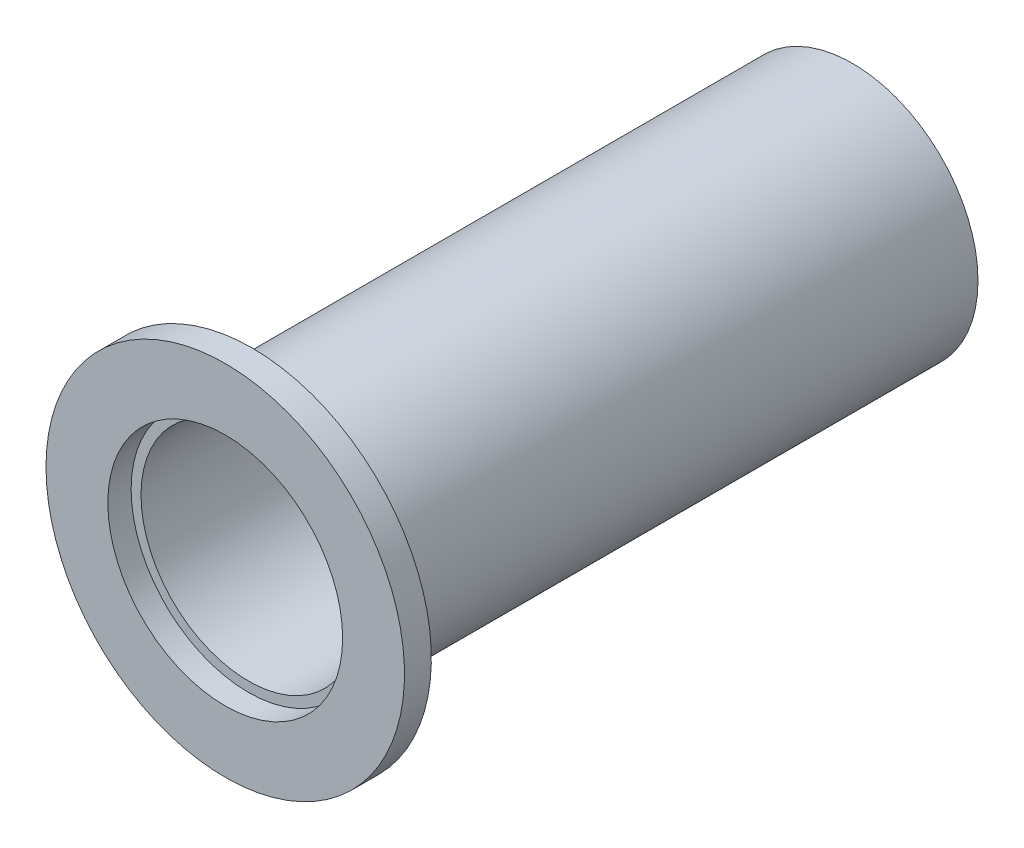
ISO-10303-21;
HEADER;
FILE_DESCRIPTION(('STEP AP214'),'2;1');
FILE_NAME('part.step','',(''),(''),'','','');
FILE_SCHEMA(('AUTOMOTIVE_DESIGN { 1 0 10303 214 1 1 1 1 }'));
ENDSEC;
DATA;
#1=APPLICATION_CONTEXT('core data for automotive mechanical design processes');
#2=APPLICATION_PROTOCOL_DEFINITION('international standard','automotive_design',2000,#1);
#3=PRODUCT_CONTEXT('',#1,'mechanical');
#4=PRODUCT('Part','Part','',(#3));
#5=PRODUCT_RELATED_PRODUCT_CATEGORY('part','',(#4));
#6=PRODUCT_DEFINITION_FORMATION('','',#4);
#7=PRODUCT_DEFINITION_CONTEXT('part definition',#1,'design');
#8=PRODUCT_DEFINITION('design','',#6,#7);
#9=PRODUCT_DEFINITION_SHAPE('','',#8);
#10=(LENGTH_UNIT() NAMED_UNIT(*) SI_UNIT(.MILLI.,.METRE.));
#11=(NAMED_UNIT(*) PLANE_ANGLE_UNIT() SI_UNIT($,.RADIAN.));
#12=(NAMED_UNIT(*) SI_UNIT($,.STERADIAN.) SOLID_ANGLE_UNIT());
#13=UNCERTAINTY_MEASURE_WITH_UNIT(LENGTH_MEASURE(1.E-05),#10,'distance_accuracy_value','');
#14=(GEOMETRIC_REPRESENTATION_CONTEXT(3) GLOBAL_UNCERTAINTY_ASSIGNED_CONTEXT((#13)) GLOBAL_UNIT_ASSIGNED_CONTEXT((#10,
#11,#12)) REPRESENTATION_CONTEXT('',''));
#15=CARTESIAN_POINT('',(0.,0.,0.));
#16=DIRECTION('',(0.,0.,1.));
#17=DIRECTION('',(1.,0.,0.));
#18=AXIS2_PLACEMENT_3D('',#15,#16,#17);
#19=CARTESIAN_POINT('',(0.,0.,68.7));
#20=DIRECTION('',(0.,0.,-1.));
#21=DIRECTION('',(-1.,0.,0.));
#22=AXIS2_PLACEMENT_3D('',#19,#20,#21);
#23=CYLINDRICAL_SURFACE('',#22,13.1);
#24=CARTESIAN_POINT('',(0.,0.,67.4));
#25=DIRECTION('',(0.,0.,-1.));
#26=DIRECTION('',(-1.,0.,0.));
#27=AXIS2_PLACEMENT_3D('',#24,#25,#26);
#28=CIRCLE('',#27,13.1);
#29=CARTESIAN_POINT('',(-13.1,0.,67.4));
#30=VERTEX_POINT('',#29);
#31=EDGE_CURVE('E17',#30,#30,#28,.F.);
#32=ORIENTED_EDGE('',*,*,#31,.F.);
#33=EDGE_LOOP('',(#32));
#34=FACE_BOUND('',#33,.T.);
#35=CARTESIAN_POINT('',(0.,0.,70.));
#36=DIRECTION('',(0.,0.,-1.));
#37=DIRECTION('',(-1.,0.,0.));
#38=AXIS2_PLACEMENT_3D('',#35,#36,#37);
#39=CIRCLE('',#38,13.1);
#40=CARTESIAN_POINT('',(-13.1,0.,70.));
#41=VERTEX_POINT('',#40);
#42=EDGE_CURVE('E43',#41,#41,#39,.T.);
#43=ORIENTED_EDGE('',*,*,#42,.F.);
#44=EDGE_LOOP('',(#43));
#45=FACE_BOUND('',#44,.T.);
#46=ADVANCED_FACE('F14',(#34,#45),#23,.F.);
#47=CARTESIAN_POINT('',(0.,12.55,67.4));
#48=DIRECTION('',(0.,0.,1.));
#49=DIRECTION('',(1.,0.,0.));
#50=AXIS2_PLACEMENT_3D('',#47,#48,#49);
#51=PLANE('',#50);
#52=CARTESIAN_POINT('',(0.,0.,67.4));
#53=DIRECTION('',(0.,0.,-1.));
#54=DIRECTION('',(-1.,0.,0.));
#55=AXIS2_PLACEMENT_3D('',#52,#53,#54);
#56=CIRCLE('',#55,12.);
#57=CARTESIAN_POINT('',(-12.,0.,67.4));
#58=VERTEX_POINT('',#57);
#59=EDGE_CURVE('E41',#58,#58,#56,.T.);
#60=ORIENTED_EDGE('',*,*,#59,.T.);
#61=EDGE_LOOP('',(#60));
#62=FACE_BOUND('',#61,.T.);
#63=ORIENTED_EDGE('',*,*,#31,.T.);
#64=EDGE_LOOP('',(#63));
#65=FACE_BOUND('',#64,.T.);
#66=ADVANCED_FACE('F50',(#62,#65),#51,.T.);
#67=CARTESIAN_POINT('',(0.,16.55,70.));
#68=DIRECTION('',(0.,0.,1.));
#69=DIRECTION('',(1.,0.,0.));
#70=AXIS2_PLACEMENT_3D('',#67,#68,#69);
#71=PLANE('',#70);
#72=ORIENTED_EDGE('',*,*,#42,.T.);
#73=EDGE_LOOP('',(#72));
#74=FACE_BOUND('',#73,.T.);
#75=CARTESIAN_POINT('',(0.,0.,70.));
#76=DIRECTION('',(0.,0.,-1.));
#77=DIRECTION('',(-1.,0.,0.));
#78=AXIS2_PLACEMENT_3D('',#75,#76,#77);
#79=CIRCLE('',#78,20.);
#80=CARTESIAN_POINT('',(-20.,0.,70.));
#81=VERTEX_POINT('',#80);
#82=EDGE_CURVE('E38',#81,#81,#79,.T.);
#83=ORIENTED_EDGE('',*,*,#82,.F.);
#84=EDGE_LOOP('',(#83));
#85=FACE_BOUND('',#84,.T.);
#86=ADVANCED_FACE('F58',(#74,#85),#71,.T.);
#87=CARTESIAN_POINT('',(0.,0.,33.7));
#88=DIRECTION('',(0.,0.,-1.));
#89=DIRECTION('',(-1.,0.,0.));
#90=AXIS2_PLACEMENT_3D('',#87,#88,#89);
#91=CYLINDRICAL_SURFACE('',#90,12.);
#92=CARTESIAN_POINT('',(0.,0.,0.));
#93=DIRECTION('',(0.,0.,-1.));
#94=DIRECTION('',(-1.,0.,0.));
#95=AXIS2_PLACEMENT_3D('',#92,#93,#94);
#96=CIRCLE('',#95,12.);
#97=CARTESIAN_POINT('',(-12.,0.,0.));
#98=VERTEX_POINT('',#97);
#99=EDGE_CURVE('E33',#98,#98,#96,.F.);
#100=ORIENTED_EDGE('',*,*,#99,.F.);
#101=EDGE_LOOP('',(#100));
#102=FACE_BOUND('',#101,.T.);
#103=ORIENTED_EDGE('',*,*,#59,.F.);
#104=EDGE_LOOP('',(#103));
#105=FACE_BOUND('',#104,.T.);
#106=ADVANCED_FACE('F78',(#102,#105),#91,.F.);
#107=CARTESIAN_POINT('',(0.,0.,68.5));
#108=DIRECTION('',(0.,0.,-1.));
#109=DIRECTION('',(-1.,0.,0.));
#110=AXIS2_PLACEMENT_3D('',#107,#108,#109);
#111=CYLINDRICAL_SURFACE('',#110,20.);
#112=ORIENTED_EDGE('',*,*,#82,.T.);
#113=EDGE_LOOP('',(#112));
#114=FACE_BOUND('',#113,.T.);
#115=CARTESIAN_POINT('',(0.,0.,67.));
#116=DIRECTION('',(0.,0.,1.));
#117=DIRECTION('',(0.,1.,0.));
#118=AXIS2_PLACEMENT_3D('',#115,#116,#117);
#119=CIRCLE('',#118,20.);
#120=CARTESIAN_POINT('',(0.,20.,67.));
#121=VERTEX_POINT('',#120);
#122=EDGE_CURVE('E26',#121,#121,#119,.F.);
#123=ORIENTED_EDGE('',*,*,#122,.F.);
#124=EDGE_LOOP('',(#123));
#125=FACE_BOUND('',#124,.T.);
#126=ADVANCED_FACE('F74',(#114,#125),#111,.T.);
#127=CARTESIAN_POINT('',(0.,13.,0.));
#128=DIRECTION('',(0.,0.,-1.));
#129=DIRECTION('',(-1.,0.,0.));
#130=AXIS2_PLACEMENT_3D('',#127,#128,#129);
#131=PLANE('',#130);
#132=ORIENTED_EDGE('',*,*,#99,.T.);
#133=EDGE_LOOP('',(#132));
#134=FACE_BOUND('',#133,.T.);
#135=CARTESIAN_POINT('',(0.,0.,0.));
#136=DIRECTION('',(0.,0.,-1.));
#137=DIRECTION('',(-1.,0.,0.));
#138=AXIS2_PLACEMENT_3D('',#135,#136,#137);
#139=CIRCLE('',#138,14.);
#140=CARTESIAN_POINT('',(-14.,0.,0.));
#141=VERTEX_POINT('',#140);
#142=EDGE_CURVE('E21',#141,#141,#139,.F.);
#143=ORIENTED_EDGE('',*,*,#142,.F.);
#144=EDGE_LOOP('',(#143));
#145=FACE_BOUND('',#144,.T.);
#146=ADVANCED_FACE('F67',(#134,#145),#131,.T.);
#147=CARTESIAN_POINT('',(0.,0.,67.));
#148=DIRECTION('',(0.,0.,1.));
#149=DIRECTION('',(1.,0.,0.));
#150=AXIS2_PLACEMENT_3D('',#147,#148,#149);
#151=CONICAL_SURFACE('',#150,20.,1.30899693899575);
#152=ORIENTED_EDGE('',*,*,#122,.T.);
#153=EDGE_LOOP('',(#152));
#154=FACE_BOUND('',#153,.T.);
#155=CARTESIAN_POINT('',(0.,0.,65.3923048454133));
#156=DIRECTION('',(0.,0.,-1.));
#157=DIRECTION('',(-1.,0.,0.));
#158=AXIS2_PLACEMENT_3D('',#155,#156,#157);
#159=CIRCLE('',#158,14.);
#160=CARTESIAN_POINT('',(-14.,0.,65.3923048454133));
#161=VERTEX_POINT('',#160);
#162=EDGE_CURVE('E10',#161,#161,#159,.T.);
#163=ORIENTED_EDGE('',*,*,#162,.F.);
#164=EDGE_LOOP('',(#163));
#165=FACE_BOUND('',#164,.T.);
#166=ADVANCED_FACE('F62',(#154,#165),#151,.T.);
#167=CARTESIAN_POINT('',(0.,0.,32.6961524227066));
#168=DIRECTION('',(0.,0.,-1.));
#169=DIRECTION('',(-1.,0.,0.));
#170=AXIS2_PLACEMENT_3D('',#167,#168,#169);
#171=CYLINDRICAL_SURFACE('',#170,14.);
#172=ORIENTED_EDGE('',*,*,#162,.T.);
#173=EDGE_LOOP('',(#172));
#174=FACE_BOUND('',#173,.T.);
#175=ORIENTED_EDGE('',*,*,#142,.T.);
#176=EDGE_LOOP('',(#175));
#177=FACE_BOUND('',#176,.T.);
#178=ADVANCED_FACE('F60',(#174,#177),#171,.T.);
#179=CLOSED_SHELL('',(#46,#66,#86,#106,#126,#146,#166,#178));
#180=MANIFOLD_SOLID_BREP('B1',#179);
#181=ADVANCED_BREP_SHAPE_REPRESENTATION('',(#18,#180),#14);
#182=SHAPE_DEFINITION_REPRESENTATION(#9,#181);
ENDSEC;
END-ISO-10303-21;
